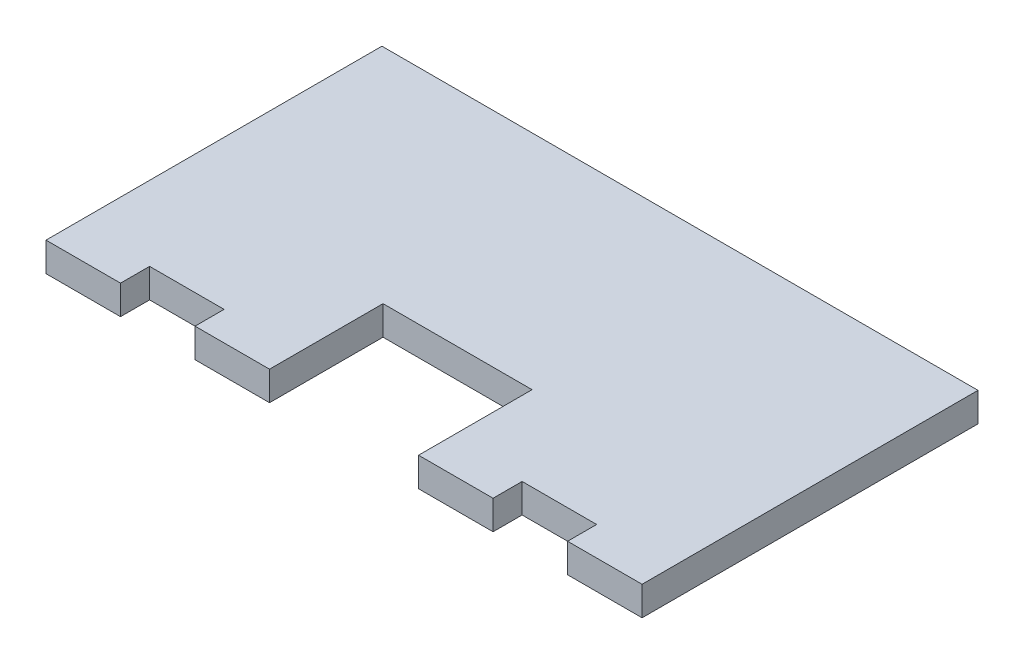
ISO-10303-21;
HEADER;
FILE_DESCRIPTION(('STEP AP214'),'2;1');
FILE_NAME('part.step','',(''),(''),'','','');
FILE_SCHEMA(('AUTOMOTIVE_DESIGN { 1 0 10303 214 1 1 1 1 }'));
ENDSEC;
DATA;
#1=APPLICATION_CONTEXT('core data for automotive mechanical design processes');
#2=APPLICATION_PROTOCOL_DEFINITION('international standard','automotive_design',2000,#1);
#3=PRODUCT_CONTEXT('',#1,'mechanical');
#4=PRODUCT('Part','Part','',(#3));
#5=PRODUCT_RELATED_PRODUCT_CATEGORY('part','',(#4));
#6=PRODUCT_DEFINITION_FORMATION('','',#4);
#7=PRODUCT_DEFINITION_CONTEXT('part definition',#1,'design');
#8=PRODUCT_DEFINITION('design','',#6,#7);
#9=PRODUCT_DEFINITION_SHAPE('','',#8);
#10=(LENGTH_UNIT() NAMED_UNIT(*) SI_UNIT(.MILLI.,.METRE.));
#11=(NAMED_UNIT(*) PLANE_ANGLE_UNIT() SI_UNIT($,.RADIAN.));
#12=(NAMED_UNIT(*) SI_UNIT($,.STERADIAN.) SOLID_ANGLE_UNIT());
#13=UNCERTAINTY_MEASURE_WITH_UNIT(LENGTH_MEASURE(1.E-05),#10,'distance_accuracy_value','');
#14=(GEOMETRIC_REPRESENTATION_CONTEXT(3) GLOBAL_UNCERTAINTY_ASSIGNED_CONTEXT((#13)) GLOBAL_UNIT_ASSIGNED_CONTEXT((#10,
#11,#12)) REPRESENTATION_CONTEXT('',''));
#15=CARTESIAN_POINT('',(0.,0.,0.));
#16=DIRECTION('',(0.,0.,1.));
#17=DIRECTION('',(1.,0.,0.));
#18=AXIS2_PLACEMENT_3D('',#15,#16,#17);
#19=CARTESIAN_POINT('',(-48.7145765258216,7.2136,40.1947248826291));
#20=DIRECTION('',(0.,0.,-1.));
#21=DIRECTION('',(-1.,0.,0.));
#22=AXIS2_PLACEMENT_3D('',#19,#20,#21);
#23=PLANE('',#22);
#24=DIRECTION('',(0.,-1.,0.));
#25=VECTOR('',#24,1.);
#26=CARTESIAN_POINT('',(-11.7321765258216,7.2136,40.1947248826291));
#27=LINE('',#26,#25);
#28=CARTESIAN_POINT('',(-11.7321765258216,7.2136,40.1947248826291));
#29=VERTEX_POINT('',#28);
#30=CARTESIAN_POINT('',(-11.7321765258216,0.,40.1947248826291));
#31=VERTEX_POINT('',#30);
#32=EDGE_CURVE('E147',#29,#31,#27,.T.);
#33=ORIENTED_EDGE('',*,*,#32,.T.);
#34=DIRECTION('',(1.,0.,0.));
#35=VECTOR('',#34,1.);
#36=CARTESIAN_POINT('',(-48.7145765258216,0.,40.1947248826291));
#37=LINE('',#36,#35);
#38=CARTESIAN_POINT('',(6.75902347417835,0.,40.1947248826291));
#39=VERTEX_POINT('',#38);
#40=EDGE_CURVE('E196',#31,#39,#37,.T.);
#41=ORIENTED_EDGE('',*,*,#40,.T.);
#42=DIRECTION('',(0.,-1.,0.));
#43=VECTOR('',#42,1.);
#44=CARTESIAN_POINT('',(6.75902347417834,7.2136,40.1947248826291));
#45=LINE('',#44,#43);
#46=CARTESIAN_POINT('',(6.75902347417834,7.2136,40.1947248826291));
#47=VERTEX_POINT('',#46);
#48=EDGE_CURVE('E56',#47,#39,#45,.T.);
#49=ORIENTED_EDGE('',*,*,#48,.F.);
#50=DIRECTION('',(1.,0.,0.));
#51=VECTOR('',#50,1.);
#52=CARTESIAN_POINT('',(-48.7145765258216,7.2136,40.1947248826291));
#53=LINE('',#52,#51);
#54=EDGE_CURVE('E166',#29,#47,#53,.T.);
#55=ORIENTED_EDGE('',*,*,#54,.F.);
#56=EDGE_LOOP('',(#33,#41,#49,#55));
#57=FACE_BOUND('',#56,.T.);
#58=ADVANCED_FACE('F33',(#57),#23,.F.);
#59=DIRECTION('',(0.,-1.,0.));
#60=VECTOR('',#59,1.);
#61=CARTESIAN_POINT('',(43.7414234741783,7.2136,40.1947248826291));
#62=LINE('',#61,#60);
#63=CARTESIAN_POINT('',(43.7414234741783,7.2136,40.1947248826291));
#64=VERTEX_POINT('',#63);
#65=CARTESIAN_POINT('',(43.7414234741783,0.,40.1947248826291));
#66=VERTEX_POINT('',#65);
#67=EDGE_CURVE('E261',#64,#66,#62,.T.);
#68=ORIENTED_EDGE('',*,*,#67,.T.);
#69=CARTESIAN_POINT('',(62.2326234741783,0.,40.1947248826291));
#70=VERTEX_POINT('',#69);
#71=EDGE_CURVE('E364',#66,#70,#37,.T.);
#72=ORIENTED_EDGE('',*,*,#71,.T.);
#73=DIRECTION('',(0.,-1.,0.));
#74=VECTOR('',#73,1.);
#75=CARTESIAN_POINT('',(62.2326234741783,7.2136,40.1947248826291));
#76=LINE('',#75,#74);
#77=CARTESIAN_POINT('',(62.2326234741783,7.2136,40.1947248826291));
#78=VERTEX_POINT('',#77);
#79=EDGE_CURVE('E48',#78,#70,#76,.T.);
#80=ORIENTED_EDGE('',*,*,#79,.F.);
#81=EDGE_CURVE('E173',#64,#78,#53,.T.);
#82=ORIENTED_EDGE('',*,*,#81,.F.);
#83=EDGE_LOOP('',(#68,#72,#80,#82));
#84=FACE_BOUND('',#83,.T.);
#85=ADVANCED_FACE('F306',(#84),#23,.F.);
#86=DIRECTION('',(0.,-1.,0.));
#87=VECTOR('',#86,1.);
#88=CARTESIAN_POINT('',(80.7238234741783,7.2136,40.1947248826291));
#89=LINE('',#88,#87);
#90=CARTESIAN_POINT('',(80.7238234741783,7.2136,40.1947248826291));
#91=VERTEX_POINT('',#90);
#92=CARTESIAN_POINT('',(80.7238234741783,0.,40.1947248826291));
#93=VERTEX_POINT('',#92);
#94=EDGE_CURVE('E232',#91,#93,#89,.T.);
#95=ORIENTED_EDGE('',*,*,#94,.T.);
#96=CARTESIAN_POINT('',(99.2150234741784,0.,40.1947248826291));
#97=VERTEX_POINT('',#96);
#98=EDGE_CURVE('E190',#93,#97,#37,.T.);
#99=ORIENTED_EDGE('',*,*,#98,.T.);
#100=DIRECTION('',(0.,-1.,0.));
#101=VECTOR('',#100,1.);
#102=CARTESIAN_POINT('',(99.2150234741784,7.2136,40.1947248826291));
#103=LINE('',#102,#101);
#104=CARTESIAN_POINT('',(99.2150234741784,7.2136,40.1947248826291));
#105=VERTEX_POINT('',#104);
#106=EDGE_CURVE('E41',#105,#97,#103,.T.);
#107=ORIENTED_EDGE('',*,*,#106,.F.);
#108=EDGE_CURVE('E177',#91,#105,#53,.T.);
#109=ORIENTED_EDGE('',*,*,#108,.F.);
#110=EDGE_LOOP('',(#95,#99,#107,#109));
#111=FACE_BOUND('',#110,.T.);
#112=ADVANCED_FACE('F231',(#111),#23,.F.);
#113=CARTESIAN_POINT('',(0.,7.2136,0.));
#114=DIRECTION('',(0.,1.,0.));
#115=DIRECTION('',(0.,0.,1.));
#116=AXIS2_PLACEMENT_3D('',#113,#114,#115);
#117=PLANE('',#116);
#118=DIRECTION('',(1.,0.,0.));
#119=VECTOR('',#118,1.);
#120=CARTESIAN_POINT('',(0.,7.2136,32.9811248826291));
#121=LINE('',#120,#119);
#122=CARTESIAN_POINT('',(-30.2233765258216,7.2136,32.9811248826291));
#123=VERTEX_POINT('',#122);
#124=CARTESIAN_POINT('',(-11.7321765258216,7.2136,32.9811248826291));
#125=VERTEX_POINT('',#124);
#126=EDGE_CURVE('E159',#123,#125,#121,.T.);
#127=ORIENTED_EDGE('',*,*,#126,.T.);
#128=DIRECTION('',(0.,0.,-1.));
#129=VECTOR('',#128,1.);
#130=CARTESIAN_POINT('',(-11.7321765258216,7.2136,0.));
#131=LINE('',#130,#129);
#132=EDGE_CURVE('E150',#29,#125,#131,.T.);
#133=ORIENTED_EDGE('',*,*,#132,.F.);
#134=ORIENTED_EDGE('',*,*,#54,.T.);
#135=DIRECTION('',(0.,0.,-1.));
#136=VECTOR('',#135,1.);
#137=CARTESIAN_POINT('',(6.75902347417835,7.2136,0.));
#138=LINE('',#137,#136);
#139=CARTESIAN_POINT('',(6.75902347417834,7.2136,12.0261248826291));
#140=VERTEX_POINT('',#139);
#141=EDGE_CURVE('E267',#47,#140,#138,.T.);
#142=ORIENTED_EDGE('',*,*,#141,.T.);
#143=DIRECTION('',(-1.,0.,0.));
#144=VECTOR('',#143,1.);
#145=CARTESIAN_POINT('',(0.,7.2136,12.0261248826291));
#146=LINE('',#145,#144);
#147=CARTESIAN_POINT('',(43.7414234741783,7.2136,12.0261248826291));
#148=VERTEX_POINT('',#147);
#149=EDGE_CURVE('E273',#148,#140,#146,.T.);
#150=ORIENTED_EDGE('',*,*,#149,.F.);
#151=DIRECTION('',(0.,0.,-1.));
#152=VECTOR('',#151,1.);
#153=CARTESIAN_POINT('',(43.7414234741783,7.2136,0.));
#154=LINE('',#153,#152);
#155=EDGE_CURVE('E257',#64,#148,#154,.T.);
#156=ORIENTED_EDGE('',*,*,#155,.F.);
#157=ORIENTED_EDGE('',*,*,#81,.T.);
#158=DIRECTION('',(0.,0.,-1.));
#159=VECTOR('',#158,1.);
#160=CARTESIAN_POINT('',(62.2326234741783,7.2136,0.));
#161=LINE('',#160,#159);
#162=CARTESIAN_POINT('',(62.2326234741783,7.2136,32.9811248826291));
#163=VERTEX_POINT('',#162);
#164=EDGE_CURVE('E237',#78,#163,#161,.T.);
#165=ORIENTED_EDGE('',*,*,#164,.T.);
#166=DIRECTION('',(-1.,0.,0.));
#167=VECTOR('',#166,1.);
#168=CARTESIAN_POINT('',(0.,7.2136,32.9811248826291));
#169=LINE('',#168,#167);
#170=CARTESIAN_POINT('',(80.7238234741783,7.2136,32.9811248826291));
#171=VERTEX_POINT('',#170);
#172=EDGE_CURVE('E234',#171,#163,#169,.T.);
#173=ORIENTED_EDGE('',*,*,#172,.F.);
#174=DIRECTION('',(0.,0.,-1.));
#175=VECTOR('',#174,1.);
#176=CARTESIAN_POINT('',(80.7238234741783,7.2136,0.));
#177=LINE('',#176,#175);
#178=EDGE_CURVE('E229',#91,#171,#177,.T.);
#179=ORIENTED_EDGE('',*,*,#178,.F.);
#180=ORIENTED_EDGE('',*,*,#108,.T.);
#181=DIRECTION('',(0.,0.,-1.));
#182=VECTOR('',#181,1.);
#183=CARTESIAN_POINT('',(99.2150234741784,7.2136,-43.1680751173709));
#184=LINE('',#183,#182);
#185=CARTESIAN_POINT('',(99.2150234741784,7.2136,-43.1680751173709));
#186=VERTEX_POINT('',#185);
#187=EDGE_CURVE('E176',#105,#186,#184,.T.);
#188=ORIENTED_EDGE('',*,*,#187,.T.);
#189=DIRECTION('',(-1.,0.,0.));
#190=VECTOR('',#189,1.);
#191=CARTESIAN_POINT('',(-48.7145765258216,7.2136,-43.1680751173709));
#192=LINE('',#191,#190);
#193=CARTESIAN_POINT('',(-48.7145765258216,7.2136,-43.1680751173709));
#194=VERTEX_POINT('',#193);
#195=EDGE_CURVE('E184',#186,#194,#192,.T.);
#196=ORIENTED_EDGE('',*,*,#195,.T.);
#197=DIRECTION('',(0.,0.,1.));
#198=VECTOR('',#197,1.);
#199=CARTESIAN_POINT('',(-48.7145765258216,7.2136,-43.1680751173709));
#200=LINE('',#199,#198);
#201=CARTESIAN_POINT('',(-48.7145765258216,7.2136,40.1947248826291));
#202=VERTEX_POINT('',#201);
#203=EDGE_CURVE('E181',#194,#202,#200,.T.);
#204=ORIENTED_EDGE('',*,*,#203,.T.);
#205=CARTESIAN_POINT('',(-30.2233765258216,7.2136,40.1947248826291));
#206=VERTEX_POINT('',#205);
#207=EDGE_CURVE('E172',#202,#206,#53,.T.);
#208=ORIENTED_EDGE('',*,*,#207,.T.);
#209=DIRECTION('',(0.,0.,-1.));
#210=VECTOR('',#209,1.);
#211=CARTESIAN_POINT('',(-30.2233765258216,7.2136,0.));
#212=LINE('',#211,#210);
#213=EDGE_CURVE('E169',#206,#123,#212,.T.);
#214=ORIENTED_EDGE('',*,*,#213,.T.);
#215=EDGE_LOOP('',(#127,#133,#134,#142,#150,#156,#157,#165,#173,#179,#180,#188,#196,#204,#208,#214));
#216=FACE_BOUND('',#215,.T.);
#217=ADVANCED_FACE('F164',(#216),#117,.T.);
#218=CARTESIAN_POINT('',(0.,0.,0.));
#219=DIRECTION('',(0.,1.,0.));
#220=DIRECTION('',(0.,0.,1.));
#221=AXIS2_PLACEMENT_3D('',#218,#219,#220);
#222=PLANE('',#221);
#223=DIRECTION('',(0.,0.,-1.));
#224=VECTOR('',#223,1.);
#225=CARTESIAN_POINT('',(-11.7321765258216,0.,0.));
#226=LINE('',#225,#224);
#227=CARTESIAN_POINT('',(-11.7321765258216,0.,32.9811248826291));
#228=VERTEX_POINT('',#227);
#229=EDGE_CURVE('E153',#31,#228,#226,.T.);
#230=ORIENTED_EDGE('',*,*,#229,.T.);
#231=DIRECTION('',(1.,0.,0.));
#232=VECTOR('',#231,1.);
#233=CARTESIAN_POINT('',(0.,0.,32.9811248826291));
#234=LINE('',#233,#232);
#235=CARTESIAN_POINT('',(-30.2233765258216,0.,32.9811248826291));
#236=VERTEX_POINT('',#235);
#237=EDGE_CURVE('E170',#236,#228,#234,.T.);
#238=ORIENTED_EDGE('',*,*,#237,.F.);
#239=DIRECTION('',(0.,0.,-1.));
#240=VECTOR('',#239,1.);
#241=CARTESIAN_POINT('',(-30.2233765258216,0.,0.));
#242=LINE('',#241,#240);
#243=CARTESIAN_POINT('',(-30.2233765258216,0.,40.1947248826291));
#244=VERTEX_POINT('',#243);
#245=EDGE_CURVE('E282',#244,#236,#242,.T.);
#246=ORIENTED_EDGE('',*,*,#245,.F.);
#247=CARTESIAN_POINT('',(-48.7145765258216,0.,40.1947248826291));
#248=VERTEX_POINT('',#247);
#249=EDGE_CURVE('E192',#248,#244,#37,.T.);
#250=ORIENTED_EDGE('',*,*,#249,.F.);
#251=DIRECTION('',(0.,0.,1.));
#252=VECTOR('',#251,1.);
#253=CARTESIAN_POINT('',(-48.7145765258216,0.,-43.1680751173709));
#254=LINE('',#253,#252);
#255=CARTESIAN_POINT('',(-48.7145765258216,0.,-43.1680751173709));
#256=VERTEX_POINT('',#255);
#257=EDGE_CURVE('E187',#256,#248,#254,.T.);
#258=ORIENTED_EDGE('',*,*,#257,.F.);
#259=DIRECTION('',(-1.,0.,0.));
#260=VECTOR('',#259,1.);
#261=CARTESIAN_POINT('',(-48.7145765258216,0.,-43.1680751173709));
#262=LINE('',#261,#260);
#263=CARTESIAN_POINT('',(99.2150234741784,0.,-43.1680751173709));
#264=VERTEX_POINT('',#263);
#265=EDGE_CURVE('E198',#264,#256,#262,.T.);
#266=ORIENTED_EDGE('',*,*,#265,.F.);
#267=DIRECTION('',(0.,0.,-1.));
#268=VECTOR('',#267,1.);
#269=CARTESIAN_POINT('',(99.2150234741784,0.,-43.1680751173709));
#270=LINE('',#269,#268);
#271=EDGE_CURVE('E195',#97,#264,#270,.T.);
#272=ORIENTED_EDGE('',*,*,#271,.F.);
#273=ORIENTED_EDGE('',*,*,#98,.F.);
#274=DIRECTION('',(0.,0.,-1.));
#275=VECTOR('',#274,1.);
#276=CARTESIAN_POINT('',(80.7238234741783,0.,0.));
#277=LINE('',#276,#275);
#278=CARTESIAN_POINT('',(80.7238234741783,0.,32.9811248826291));
#279=VERTEX_POINT('',#278);
#280=EDGE_CURVE('E250',#93,#279,#277,.T.);
#281=ORIENTED_EDGE('',*,*,#280,.T.);
#282=DIRECTION('',(-1.,0.,0.));
#283=VECTOR('',#282,1.);
#284=CARTESIAN_POINT('',(0.,0.,32.9811248826291));
#285=LINE('',#284,#283);
#286=CARTESIAN_POINT('',(62.2326234741783,0.,32.9811248826291));
#287=VERTEX_POINT('',#286);
#288=EDGE_CURVE('E245',#279,#287,#285,.T.);
#289=ORIENTED_EDGE('',*,*,#288,.T.);
#290=DIRECTION('',(0.,0.,-1.));
#291=VECTOR('',#290,1.);
#292=CARTESIAN_POINT('',(62.2326234741783,0.,0.));
#293=LINE('',#292,#291);
#294=EDGE_CURVE('E248',#70,#287,#293,.T.);
#295=ORIENTED_EDGE('',*,*,#294,.F.);
#296=ORIENTED_EDGE('',*,*,#71,.F.);
#297=DIRECTION('',(0.,0.,-1.));
#298=VECTOR('',#297,1.);
#299=CARTESIAN_POINT('',(43.7414234741783,0.,0.));
#300=LINE('',#299,#298);
#301=CARTESIAN_POINT('',(43.7414234741783,0.,12.0261248826291));
#302=VERTEX_POINT('',#301);
#303=EDGE_CURVE('E264',#66,#302,#300,.T.);
#304=ORIENTED_EDGE('',*,*,#303,.T.);
#305=DIRECTION('',(-1.,0.,0.));
#306=VECTOR('',#305,1.);
#307=CARTESIAN_POINT('',(0.,0.,12.0261248826291));
#308=LINE('',#307,#306);
#309=CARTESIAN_POINT('',(6.75902347417834,0.,12.0261248826291));
#310=VERTEX_POINT('',#309);
#311=EDGE_CURVE('E268',#302,#310,#308,.T.);
#312=ORIENTED_EDGE('',*,*,#311,.T.);
#313=DIRECTION('',(0.,0.,-1.));
#314=VECTOR('',#313,1.);
#315=CARTESIAN_POINT('',(6.75902347417835,0.,0.));
#316=LINE('',#315,#314);
#317=EDGE_CURVE('E244',#39,#310,#316,.T.);
#318=ORIENTED_EDGE('',*,*,#317,.F.);
#319=ORIENTED_EDGE('',*,*,#40,.F.);
#320=EDGE_LOOP('',(#230,#238,#246,#250,#258,#266,#272,#273,#281,#289,#295,#296,#304,#312,#318,#319));
#321=FACE_BOUND('',#320,.T.);
#322=ADVANCED_FACE('F216',(#321),#222,.F.);
#323=CARTESIAN_POINT('',(-48.7145765258216,7.2136,-43.1680751173709));
#324=DIRECTION('',(1.,0.,0.));
#325=DIRECTION('',(0.,0.,-1.));
#326=AXIS2_PLACEMENT_3D('',#323,#324,#325);
#327=PLANE('',#326);
#328=ORIENTED_EDGE('',*,*,#257,.T.);
#329=DIRECTION('',(0.,-1.,0.));
#330=VECTOR('',#329,1.);
#331=CARTESIAN_POINT('',(-48.7145765258216,7.2136,40.1947248826291));
#332=LINE('',#331,#330);
#333=EDGE_CURVE('E11',#202,#248,#332,.T.);
#334=ORIENTED_EDGE('',*,*,#333,.F.);
#335=ORIENTED_EDGE('',*,*,#203,.F.);
#336=DIRECTION('',(0.,-1.,0.));
#337=VECTOR('',#336,1.);
#338=CARTESIAN_POINT('',(-48.7145765258216,7.2136,-43.1680751173709));
#339=LINE('',#338,#337);
#340=EDGE_CURVE('E186',#194,#256,#339,.T.);
#341=ORIENTED_EDGE('',*,*,#340,.T.);
#342=EDGE_LOOP('',(#328,#334,#335,#341));
#343=FACE_BOUND('',#342,.T.);
#344=ADVANCED_FACE('F35',(#343),#327,.F.);
#345=ORIENTED_EDGE('',*,*,#249,.T.);
#346=DIRECTION('',(0.,-1.,0.));
#347=VECTOR('',#346,1.);
#348=CARTESIAN_POINT('',(-30.2233765258216,7.2136,40.1947248826291));
#349=LINE('',#348,#347);
#350=EDGE_CURVE('E158',#206,#244,#349,.T.);
#351=ORIENTED_EDGE('',*,*,#350,.F.);
#352=ORIENTED_EDGE('',*,*,#207,.F.);
#353=ORIENTED_EDGE('',*,*,#333,.T.);
#354=EDGE_LOOP('',(#345,#351,#352,#353));
#355=FACE_BOUND('',#354,.T.);
#356=ADVANCED_FACE('F292',(#355),#23,.F.);
#357=CARTESIAN_POINT('',(99.2150234741784,7.2136,-43.1680751173709));
#358=DIRECTION('',(-1.,0.,0.));
#359=DIRECTION('',(0.,0.,1.));
#360=AXIS2_PLACEMENT_3D('',#357,#358,#359);
#361=PLANE('',#360);
#362=ORIENTED_EDGE('',*,*,#271,.T.);
#363=DIRECTION('',(0.,-1.,0.));
#364=VECTOR('',#363,1.);
#365=CARTESIAN_POINT('',(99.2150234741784,7.2136,-43.1680751173709));
#366=LINE('',#365,#364);
#367=EDGE_CURVE('E202',#186,#264,#366,.T.);
#368=ORIENTED_EDGE('',*,*,#367,.F.);
#369=ORIENTED_EDGE('',*,*,#187,.F.);
#370=ORIENTED_EDGE('',*,*,#106,.T.);
#371=EDGE_LOOP('',(#362,#368,#369,#370));
#372=FACE_BOUND('',#371,.T.);
#373=ADVANCED_FACE('F209',(#372),#361,.F.);
#374=CARTESIAN_POINT('',(-48.7145765258216,7.2136,-43.1680751173709));
#375=DIRECTION('',(0.,0.,1.));
#376=DIRECTION('',(1.,0.,0.));
#377=AXIS2_PLACEMENT_3D('',#374,#375,#376);
#378=PLANE('',#377);
#379=ORIENTED_EDGE('',*,*,#265,.T.);
#380=ORIENTED_EDGE('',*,*,#340,.F.);
#381=ORIENTED_EDGE('',*,*,#195,.F.);
#382=ORIENTED_EDGE('',*,*,#367,.T.);
#383=EDGE_LOOP('',(#379,#380,#381,#382));
#384=FACE_BOUND('',#383,.T.);
#385=ADVANCED_FACE('F221',(#384),#378,.F.);
#386=CARTESIAN_POINT('',(80.7238234741783,7.2136,0.));
#387=DIRECTION('',(-1.,0.,0.));
#388=DIRECTION('',(0.,0.,1.));
#389=AXIS2_PLACEMENT_3D('',#386,#387,#388);
#390=PLANE('',#389);
#391=ORIENTED_EDGE('',*,*,#280,.F.);
#392=ORIENTED_EDGE('',*,*,#94,.F.);
#393=ORIENTED_EDGE('',*,*,#178,.T.);
#394=DIRECTION('',(0.,-1.,0.));
#395=VECTOR('',#394,1.);
#396=CARTESIAN_POINT('',(80.7238234741783,7.2136,32.9811248826291));
#397=LINE('',#396,#395);
#398=EDGE_CURVE('E241',#171,#279,#397,.T.);
#399=ORIENTED_EDGE('',*,*,#398,.T.);
#400=EDGE_LOOP('',(#391,#392,#393,#399));
#401=FACE_BOUND('',#400,.T.);
#402=ADVANCED_FACE('F327',(#401),#390,.T.);
#403=CARTESIAN_POINT('',(0.,7.2136,32.9811248826291));
#404=DIRECTION('',(0.,0.,1.));
#405=DIRECTION('',(1.,0.,0.));
#406=AXIS2_PLACEMENT_3D('',#403,#404,#405);
#407=PLANE('',#406);
#408=ORIENTED_EDGE('',*,*,#288,.F.);
#409=ORIENTED_EDGE('',*,*,#398,.F.);
#410=ORIENTED_EDGE('',*,*,#172,.T.);
#411=DIRECTION('',(0.,-1.,0.));
#412=VECTOR('',#411,1.);
#413=CARTESIAN_POINT('',(62.2326234741783,7.2136,32.9811248826291));
#414=LINE('',#413,#412);
#415=EDGE_CURVE('E235',#163,#287,#414,.T.);
#416=ORIENTED_EDGE('',*,*,#415,.T.);
#417=EDGE_LOOP('',(#408,#409,#410,#416));
#418=FACE_BOUND('',#417,.T.);
#419=ADVANCED_FACE('F334',(#418),#407,.T.);
#420=CARTESIAN_POINT('',(62.2326234741783,7.2136,0.));
#421=DIRECTION('',(-1.,0.,0.));
#422=DIRECTION('',(0.,0.,1.));
#423=AXIS2_PLACEMENT_3D('',#420,#421,#422);
#424=PLANE('',#423);
#425=ORIENTED_EDGE('',*,*,#294,.T.);
#426=ORIENTED_EDGE('',*,*,#415,.F.);
#427=ORIENTED_EDGE('',*,*,#164,.F.);
#428=ORIENTED_EDGE('',*,*,#79,.T.);
#429=EDGE_LOOP('',(#425,#426,#427,#428));
#430=FACE_BOUND('',#429,.T.);
#431=ADVANCED_FACE('F338',(#430),#424,.F.);
#432=CARTESIAN_POINT('',(43.7414234741783,7.2136,0.));
#433=DIRECTION('',(-1.,0.,0.));
#434=DIRECTION('',(0.,0.,1.));
#435=AXIS2_PLACEMENT_3D('',#432,#433,#434);
#436=PLANE('',#435);
#437=ORIENTED_EDGE('',*,*,#303,.F.);
#438=ORIENTED_EDGE('',*,*,#67,.F.);
#439=ORIENTED_EDGE('',*,*,#155,.T.);
#440=DIRECTION('',(0.,-1.,0.));
#441=VECTOR('',#440,1.);
#442=CARTESIAN_POINT('',(43.7414234741783,7.2136,12.0261248826291));
#443=LINE('',#442,#441);
#444=EDGE_CURVE('E259',#148,#302,#443,.T.);
#445=ORIENTED_EDGE('',*,*,#444,.T.);
#446=EDGE_LOOP('',(#437,#438,#439,#445));
#447=FACE_BOUND('',#446,.T.);
#448=ADVANCED_FACE('F346',(#447),#436,.T.);
#449=CARTESIAN_POINT('',(0.,7.2136,12.0261248826291));
#450=DIRECTION('',(0.,0.,1.));
#451=DIRECTION('',(1.,0.,0.));
#452=AXIS2_PLACEMENT_3D('',#449,#450,#451);
#453=PLANE('',#452);
#454=ORIENTED_EDGE('',*,*,#311,.F.);
#455=ORIENTED_EDGE('',*,*,#444,.F.);
#456=ORIENTED_EDGE('',*,*,#149,.T.);
#457=DIRECTION('',(0.,-1.,0.));
#458=VECTOR('',#457,1.);
#459=CARTESIAN_POINT('',(6.75902347417834,7.2136,12.0261248826291));
#460=LINE('',#459,#458);
#461=EDGE_CURVE('E256',#140,#310,#460,.T.);
#462=ORIENTED_EDGE('',*,*,#461,.T.);
#463=EDGE_LOOP('',(#454,#455,#456,#462));
#464=FACE_BOUND('',#463,.T.);
#465=ADVANCED_FACE('F350',(#464),#453,.T.);
#466=CARTESIAN_POINT('',(6.75902347417835,7.2136,0.));
#467=DIRECTION('',(-1.,0.,0.));
#468=DIRECTION('',(0.,0.,1.));
#469=AXIS2_PLACEMENT_3D('',#466,#467,#468);
#470=PLANE('',#469);
#471=ORIENTED_EDGE('',*,*,#317,.T.);
#472=ORIENTED_EDGE('',*,*,#461,.F.);
#473=ORIENTED_EDGE('',*,*,#141,.F.);
#474=ORIENTED_EDGE('',*,*,#48,.T.);
#475=EDGE_LOOP('',(#471,#472,#473,#474));
#476=FACE_BOUND('',#475,.T.);
#477=ADVANCED_FACE('F303',(#476),#470,.F.);
#478=CARTESIAN_POINT('',(-11.7321765258216,7.2136,0.));
#479=DIRECTION('',(-1.,0.,0.));
#480=DIRECTION('',(0.,0.,1.));
#481=AXIS2_PLACEMENT_3D('',#478,#479,#480);
#482=PLANE('',#481);
#483=ORIENTED_EDGE('',*,*,#229,.F.);
#484=ORIENTED_EDGE('',*,*,#32,.F.);
#485=ORIENTED_EDGE('',*,*,#132,.T.);
#486=DIRECTION('',(0.,-1.,0.));
#487=VECTOR('',#486,1.);
#488=CARTESIAN_POINT('',(-11.7321765258216,7.2136,32.9811248826291));
#489=LINE('',#488,#487);
#490=EDGE_CURVE('E191',#125,#228,#489,.T.);
#491=ORIENTED_EDGE('',*,*,#490,.T.);
#492=EDGE_LOOP('',(#483,#484,#485,#491));
#493=FACE_BOUND('',#492,.T.);
#494=ADVANCED_FACE('F149',(#493),#482,.T.);
#495=CARTESIAN_POINT('',(0.,7.2136,32.9811248826291));
#496=DIRECTION('',(0.,0.,-1.));
#497=DIRECTION('',(-1.,0.,0.));
#498=AXIS2_PLACEMENT_3D('',#495,#496,#497);
#499=PLANE('',#498);
#500=ORIENTED_EDGE('',*,*,#237,.T.);
#501=ORIENTED_EDGE('',*,*,#490,.F.);
#502=ORIENTED_EDGE('',*,*,#126,.F.);
#503=DIRECTION('',(0.,-1.,0.));
#504=VECTOR('',#503,1.);
#505=CARTESIAN_POINT('',(-30.2233765258216,7.2136,32.9811248826291));
#506=LINE('',#505,#504);
#507=EDGE_CURVE('E277',#123,#236,#506,.T.);
#508=ORIENTED_EDGE('',*,*,#507,.T.);
#509=EDGE_LOOP('',(#500,#501,#502,#508));
#510=FACE_BOUND('',#509,.T.);
#511=ADVANCED_FACE('F295',(#510),#499,.F.);
#512=CARTESIAN_POINT('',(-30.2233765258216,7.2136,0.));
#513=DIRECTION('',(-1.,0.,0.));
#514=DIRECTION('',(0.,0.,1.));
#515=AXIS2_PLACEMENT_3D('',#512,#513,#514);
#516=PLANE('',#515);
#517=ORIENTED_EDGE('',*,*,#245,.T.);
#518=ORIENTED_EDGE('',*,*,#507,.F.);
#519=ORIENTED_EDGE('',*,*,#213,.F.);
#520=ORIENTED_EDGE('',*,*,#350,.T.);
#521=EDGE_LOOP('',(#517,#518,#519,#520));
#522=FACE_BOUND('',#521,.T.);
#523=ADVANCED_FACE('F289',(#522),#516,.F.);
#524=CLOSED_SHELL('',(#58,#85,#112,#217,#322,#344,#356,#373,#385,#402,#419,#431,#448,#465,#477,
#494,#511,#523));
#525=MANIFOLD_SOLID_BREP('B2',#524);
#526=ADVANCED_BREP_SHAPE_REPRESENTATION('',(#18,#525),#14);
#527=SHAPE_DEFINITION_REPRESENTATION(#9,#526);
ENDSEC;
END-ISO-10303-21;
